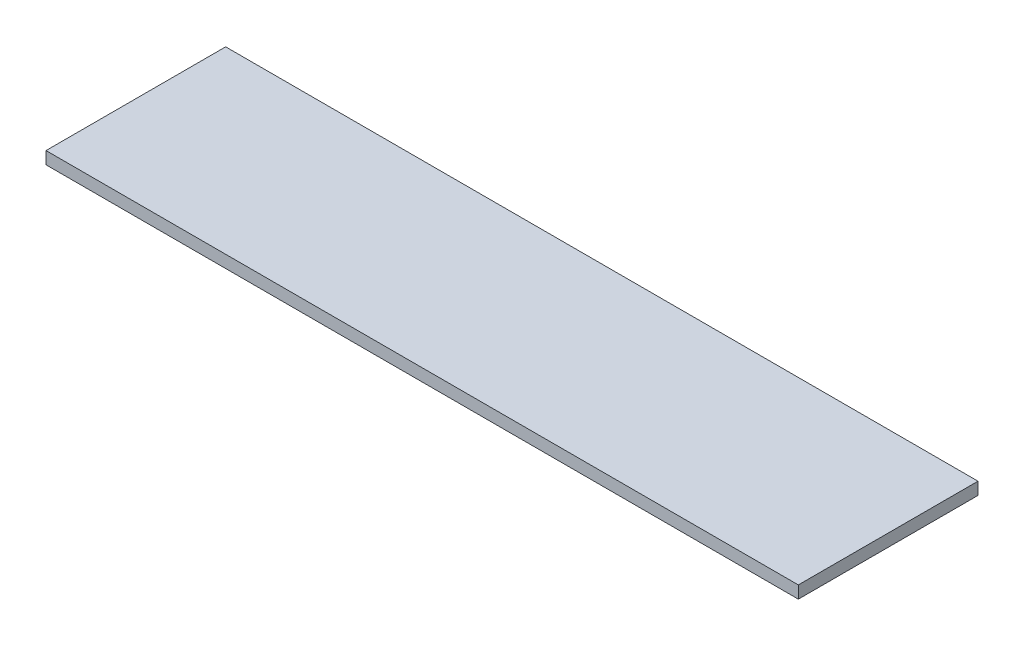
ISO-10303-21;
HEADER;
FILE_DESCRIPTION(('STEP AP214'),'2;1');
FILE_NAME('part.step','',(''),(''),'','','');
FILE_SCHEMA(('AUTOMOTIVE_DESIGN { 1 0 10303 214 1 1 1 1 }'));
ENDSEC;
DATA;
#1=APPLICATION_CONTEXT('core data for automotive mechanical design processes');
#2=APPLICATION_PROTOCOL_DEFINITION('international standard','automotive_design',2000,#1);
#3=PRODUCT_CONTEXT('',#1,'mechanical');
#4=PRODUCT('Part','Part','',(#3));
#5=PRODUCT_RELATED_PRODUCT_CATEGORY('part','',(#4));
#6=PRODUCT_DEFINITION_FORMATION('','',#4);
#7=PRODUCT_DEFINITION_CONTEXT('part definition',#1,'design');
#8=PRODUCT_DEFINITION('design','',#6,#7);
#9=PRODUCT_DEFINITION_SHAPE('','',#8);
#10=(LENGTH_UNIT() NAMED_UNIT(*) SI_UNIT(.MILLI.,.METRE.));
#11=(NAMED_UNIT(*) PLANE_ANGLE_UNIT() SI_UNIT($,.RADIAN.));
#12=(NAMED_UNIT(*) SI_UNIT($,.STERADIAN.) SOLID_ANGLE_UNIT());
#13=UNCERTAINTY_MEASURE_WITH_UNIT(LENGTH_MEASURE(1.E-05),#10,'distance_accuracy_value','');
#14=(GEOMETRIC_REPRESENTATION_CONTEXT(3) GLOBAL_UNCERTAINTY_ASSIGNED_CONTEXT((#13)) GLOBAL_UNIT_ASSIGNED_CONTEXT((#10,
#11,#12)) REPRESENTATION_CONTEXT('',''));
#15=CARTESIAN_POINT('',(0.,0.,0.));
#16=DIRECTION('',(0.,0.,1.));
#17=DIRECTION('',(1.,0.,0.));
#18=AXIS2_PLACEMENT_3D('',#15,#16,#17);
#19=CARTESIAN_POINT('',(33.5,1.1,-8.));
#20=DIRECTION('',(0.,0.,1.));
#21=DIRECTION('',(1.,0.,0.));
#22=AXIS2_PLACEMENT_3D('',#19,#20,#21);
#23=PLANE('',#22);
#24=DIRECTION('',(-1.,0.,0.));
#25=VECTOR('',#24,1.);
#26=CARTESIAN_POINT('',(33.5,0.,-8.));
#27=LINE('',#26,#25);
#28=CARTESIAN_POINT('',(33.5,0.,-8.));
#29=VERTEX_POINT('',#28);
#30=CARTESIAN_POINT('',(-33.5,0.,-8.));
#31=VERTEX_POINT('',#30);
#32=EDGE_CURVE('E11',#29,#31,#27,.T.);
#33=ORIENTED_EDGE('',*,*,#32,.T.);
#34=DIRECTION('',(0.,-1.,0.));
#35=VECTOR('',#34,1.);
#36=CARTESIAN_POINT('',(-33.5,1.1,-8.));
#37=LINE('',#36,#35);
#38=CARTESIAN_POINT('',(-33.5,1.1,-8.));
#39=VERTEX_POINT('',#38);
#40=EDGE_CURVE('E41',#39,#31,#37,.T.);
#41=ORIENTED_EDGE('',*,*,#40,.F.);
#42=DIRECTION('',(-1.,0.,0.));
#43=VECTOR('',#42,1.);
#44=CARTESIAN_POINT('',(33.5,1.1,-8.));
#45=LINE('',#44,#43);
#46=CARTESIAN_POINT('',(33.5,1.1,-8.));
#47=VERTEX_POINT('',#46);
#48=EDGE_CURVE('E77',#47,#39,#45,.T.);
#49=ORIENTED_EDGE('',*,*,#48,.F.);
#50=DIRECTION('',(0.,-1.,0.));
#51=VECTOR('',#50,1.);
#52=CARTESIAN_POINT('',(33.5,1.1,-8.));
#53=LINE('',#52,#51);
#54=EDGE_CURVE('E26',#47,#29,#53,.T.);
#55=ORIENTED_EDGE('',*,*,#54,.T.);
#56=EDGE_LOOP('',(#33,#41,#49,#55));
#57=FACE_BOUND('',#56,.T.);
#58=ADVANCED_FACE('F16',(#57),#23,.F.);
#59=CARTESIAN_POINT('',(-33.5,1.1,-8.));
#60=DIRECTION('',(1.,0.,0.));
#61=DIRECTION('',(0.,1.,0.));
#62=AXIS2_PLACEMENT_3D('',#59,#60,#61);
#63=PLANE('',#62);
#64=DIRECTION('',(0.,0.,1.));
#65=VECTOR('',#64,1.);
#66=CARTESIAN_POINT('',(-33.5,0.,-8.));
#67=LINE('',#66,#65);
#68=CARTESIAN_POINT('',(-33.5,0.,8.));
#69=VERTEX_POINT('',#68);
#70=EDGE_CURVE('E82',#31,#69,#67,.T.);
#71=ORIENTED_EDGE('',*,*,#70,.T.);
#72=DIRECTION('',(0.,-1.,0.));
#73=VECTOR('',#72,1.);
#74=CARTESIAN_POINT('',(-33.5,1.1,8.));
#75=LINE('',#74,#73);
#76=CARTESIAN_POINT('',(-33.5,1.1,8.));
#77=VERTEX_POINT('',#76);
#78=EDGE_CURVE('E62',#77,#69,#75,.T.);
#79=ORIENTED_EDGE('',*,*,#78,.F.);
#80=DIRECTION('',(0.,0.,1.));
#81=VECTOR('',#80,1.);
#82=CARTESIAN_POINT('',(-33.5,1.1,-8.));
#83=LINE('',#82,#81);
#84=EDGE_CURVE('E71',#39,#77,#83,.T.);
#85=ORIENTED_EDGE('',*,*,#84,.F.);
#86=ORIENTED_EDGE('',*,*,#40,.T.);
#87=EDGE_LOOP('',(#71,#79,#85,#86));
#88=FACE_BOUND('',#87,.T.);
#89=ADVANCED_FACE('F80',(#88),#63,.F.);
#90=CARTESIAN_POINT('',(-33.5,1.1,8.));
#91=DIRECTION('',(0.,0.,-1.));
#92=DIRECTION('',(0.,-1.,0.));
#93=AXIS2_PLACEMENT_3D('',#90,#91,#92);
#94=PLANE('',#93);
#95=DIRECTION('',(1.,0.,0.));
#96=VECTOR('',#95,1.);
#97=CARTESIAN_POINT('',(-33.5,0.,8.));
#98=LINE('',#97,#96);
#99=CARTESIAN_POINT('',(33.5,0.,8.));
#100=VERTEX_POINT('',#99);
#101=EDGE_CURVE('E85',#69,#100,#98,.T.);
#102=ORIENTED_EDGE('',*,*,#101,.T.);
#103=DIRECTION('',(0.,-1.,0.));
#104=VECTOR('',#103,1.);
#105=CARTESIAN_POINT('',(33.5,1.1,8.));
#106=LINE('',#105,#104);
#107=CARTESIAN_POINT('',(33.5,1.1,8.));
#108=VERTEX_POINT('',#107);
#109=EDGE_CURVE('E87',#108,#100,#106,.T.);
#110=ORIENTED_EDGE('',*,*,#109,.F.);
#111=DIRECTION('',(1.,0.,0.));
#112=VECTOR('',#111,1.);
#113=CARTESIAN_POINT('',(-33.5,1.1,8.));
#114=LINE('',#113,#112);
#115=EDGE_CURVE('E74',#77,#108,#114,.T.);
#116=ORIENTED_EDGE('',*,*,#115,.F.);
#117=ORIENTED_EDGE('',*,*,#78,.T.);
#118=EDGE_LOOP('',(#102,#110,#116,#117));
#119=FACE_BOUND('',#118,.T.);
#120=ADVANCED_FACE('F86',(#119),#94,.F.);
#121=CARTESIAN_POINT('',(33.5,1.1,8.));
#122=DIRECTION('',(-1.,0.,0.));
#123=DIRECTION('',(0.,0.,1.));
#124=AXIS2_PLACEMENT_3D('',#121,#122,#123);
#125=PLANE('',#124);
#126=DIRECTION('',(0.,0.,-1.));
#127=VECTOR('',#126,1.);
#128=CARTESIAN_POINT('',(33.5,0.,8.));
#129=LINE('',#128,#127);
#130=EDGE_CURVE('E19',#100,#29,#129,.T.);
#131=ORIENTED_EDGE('',*,*,#130,.T.);
#132=ORIENTED_EDGE('',*,*,#54,.F.);
#133=DIRECTION('',(0.,0.,-1.));
#134=VECTOR('',#133,1.);
#135=CARTESIAN_POINT('',(33.5,1.1,8.));
#136=LINE('',#135,#134);
#137=EDGE_CURVE('E90',#108,#47,#136,.T.);
#138=ORIENTED_EDGE('',*,*,#137,.F.);
#139=ORIENTED_EDGE('',*,*,#109,.T.);
#140=EDGE_LOOP('',(#131,#132,#138,#139));
#141=FACE_BOUND('',#140,.T.);
#142=ADVANCED_FACE('F141',(#141),#125,.F.);
#143=CARTESIAN_POINT('',(0.,1.1,0.));
#144=DIRECTION('',(0.,1.,0.));
#145=DIRECTION('',(1.,0.,0.));
#146=AXIS2_PLACEMENT_3D('',#143,#144,#145);
#147=PLANE('',#146);
#148=ORIENTED_EDGE('',*,*,#48,.T.);
#149=ORIENTED_EDGE('',*,*,#84,.T.);
#150=ORIENTED_EDGE('',*,*,#115,.T.);
#151=ORIENTED_EDGE('',*,*,#137,.T.);
#152=EDGE_LOOP('',(#148,#149,#150,#151));
#153=FACE_BOUND('',#152,.T.);
#154=ADVANCED_FACE('F72',(#153),#147,.T.);
#155=CARTESIAN_POINT('',(0.,0.,0.));
#156=DIRECTION('',(0.,1.,0.));
#157=DIRECTION('',(1.,0.,0.));
#158=AXIS2_PLACEMENT_3D('',#155,#156,#157);
#159=PLANE('',#158);
#160=ORIENTED_EDGE('',*,*,#32,.F.);
#161=ORIENTED_EDGE('',*,*,#130,.F.);
#162=ORIENTED_EDGE('',*,*,#101,.F.);
#163=ORIENTED_EDGE('',*,*,#70,.F.);
#164=EDGE_LOOP('',(#160,#161,#162,#163));
#165=FACE_BOUND('',#164,.T.);
#166=ADVANCED_FACE('F123',(#165),#159,.F.);
#167=CLOSED_SHELL('',(#58,#89,#120,#142,#154,#166));
#168=MANIFOLD_SOLID_BREP('B1',#167);
#169=ADVANCED_BREP_SHAPE_REPRESENTATION('',(#18,#168),#14);
#170=SHAPE_DEFINITION_REPRESENTATION(#9,#169);
ENDSEC;
END-ISO-10303-21;
